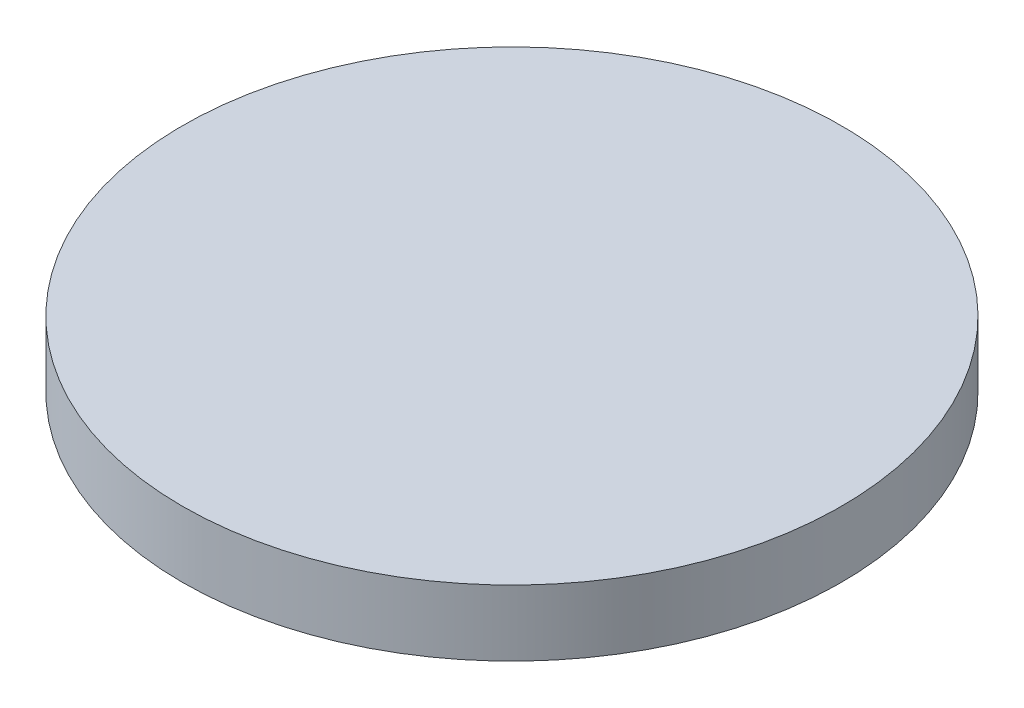
ISO-10303-21;
HEADER;
FILE_DESCRIPTION(('STEP AP214'),'2;1');
FILE_NAME('part.step','',(''),(''),'','','');
FILE_SCHEMA(('AUTOMOTIVE_DESIGN { 1 0 10303 214 1 1 1 1 }'));
ENDSEC;
DATA;
#1=APPLICATION_CONTEXT('core data for automotive mechanical design processes');
#2=APPLICATION_PROTOCOL_DEFINITION('international standard','automotive_design',2000,#1);
#3=PRODUCT_CONTEXT('',#1,'mechanical');
#4=PRODUCT('Part','Part','',(#3));
#5=PRODUCT_RELATED_PRODUCT_CATEGORY('part','',(#4));
#6=PRODUCT_DEFINITION_FORMATION('','',#4);
#7=PRODUCT_DEFINITION_CONTEXT('part definition',#1,'design');
#8=PRODUCT_DEFINITION('design','',#6,#7);
#9=PRODUCT_DEFINITION_SHAPE('','',#8);
#10=(LENGTH_UNIT() NAMED_UNIT(*) SI_UNIT(.MILLI.,.METRE.));
#11=(NAMED_UNIT(*) PLANE_ANGLE_UNIT() SI_UNIT($,.RADIAN.));
#12=(NAMED_UNIT(*) SI_UNIT($,.STERADIAN.) SOLID_ANGLE_UNIT());
#13=UNCERTAINTY_MEASURE_WITH_UNIT(LENGTH_MEASURE(1.E-05),#10,'distance_accuracy_value','');
#14=(GEOMETRIC_REPRESENTATION_CONTEXT(3) GLOBAL_UNCERTAINTY_ASSIGNED_CONTEXT((#13)) GLOBAL_UNIT_ASSIGNED_CONTEXT((#10,
#11,#12)) REPRESENTATION_CONTEXT('',''));
#15=CARTESIAN_POINT('',(0.,0.,0.));
#16=DIRECTION('',(0.,0.,1.));
#17=DIRECTION('',(1.,0.,0.));
#18=AXIS2_PLACEMENT_3D('',#15,#16,#17);
#19=CARTESIAN_POINT('',(0.,0.,0.));
#20=DIRECTION('',(0.,1.,0.));
#21=DIRECTION('',(0.,0.,1.));
#22=AXIS2_PLACEMENT_3D('',#19,#20,#21);
#23=PLANE('',#22);
#24=CARTESIAN_POINT('',(0.,0.,0.));
#25=DIRECTION('',(0.,1.,0.));
#26=DIRECTION('',(0.,0.,1.));
#27=AXIS2_PLACEMENT_3D('',#24,#25,#26);
#28=CIRCLE('',#27,10.);
#29=CARTESIAN_POINT('',(0.,0.,10.));
#30=VERTEX_POINT('',#29);
#31=EDGE_CURVE('E42',#30,#30,#28,.T.);
#32=ORIENTED_EDGE('',*,*,#31,.F.);
#33=EDGE_LOOP('',(#32));
#34=FACE_BOUND('',#33,.T.);
#35=CARTESIAN_POINT('',(0.,0.,0.));
#36=DIRECTION('',(0.,1.,0.));
#37=DIRECTION('',(0.,0.,1.));
#38=AXIS2_PLACEMENT_3D('',#35,#36,#37);
#39=CIRCLE('',#38,4.9);
#40=CARTESIAN_POINT('',(0.,0.,4.9));
#41=VERTEX_POINT('',#40);
#42=EDGE_CURVE('E10',#41,#41,#39,.F.);
#43=ORIENTED_EDGE('',*,*,#42,.F.);
#44=EDGE_LOOP('',(#43));
#45=FACE_BOUND('',#44,.T.);
#46=ADVANCED_FACE('F31',(#34,#45),#23,.F.);
#47=CARTESIAN_POINT('',(0.,2.,0.));
#48=DIRECTION('',(0.,-1.,0.));
#49=DIRECTION('',(0.,0.,-1.));
#50=AXIS2_PLACEMENT_3D('',#47,#48,#49);
#51=CYLINDRICAL_SURFACE('',#50,10.);
#52=CARTESIAN_POINT('',(0.,2.,0.));
#53=DIRECTION('',(0.,1.,0.));
#54=DIRECTION('',(0.,0.,1.));
#55=AXIS2_PLACEMENT_3D('',#52,#53,#54);
#56=CIRCLE('',#55,10.);
#57=CARTESIAN_POINT('',(0.,2.,10.));
#58=VERTEX_POINT('',#57);
#59=EDGE_CURVE('E38',#58,#58,#56,.T.);
#60=ORIENTED_EDGE('',*,*,#59,.F.);
#61=EDGE_LOOP('',(#60));
#62=FACE_BOUND('',#61,.T.);
#63=ORIENTED_EDGE('',*,*,#31,.T.);
#64=EDGE_LOOP('',(#63));
#65=FACE_BOUND('',#64,.T.);
#66=ADVANCED_FACE('F33',(#62,#65),#51,.T.);
#67=CARTESIAN_POINT('',(0.,2.,0.));
#68=DIRECTION('',(0.,1.,0.));
#69=DIRECTION('',(0.,0.,1.));
#70=AXIS2_PLACEMENT_3D('',#67,#68,#69);
#71=PLANE('',#70);
#72=ORIENTED_EDGE('',*,*,#59,.T.);
#73=EDGE_LOOP('',(#72));
#74=FACE_BOUND('',#73,.T.);
#75=ADVANCED_FACE('F56',(#74),#71,.T.);
#76=CARTESIAN_POINT('',(0.,-2.9,0.));
#77=DIRECTION('',(0.,1.,0.));
#78=DIRECTION('',(0.,0.,1.));
#79=AXIS2_PLACEMENT_3D('',#76,#77,#78);
#80=CYLINDRICAL_SURFACE('',#79,4.9);
#81=CARTESIAN_POINT('',(0.,-2.9,0.));
#82=DIRECTION('',(0.,-1.,0.));
#83=DIRECTION('',(0.,0.,-1.));
#84=AXIS2_PLACEMENT_3D('',#81,#82,#83);
#85=CIRCLE('',#84,4.9);
#86=CARTESIAN_POINT('',(0.,-2.9,-4.9));
#87=VERTEX_POINT('',#86);
#88=EDGE_CURVE('E47',#87,#87,#85,.T.);
#89=ORIENTED_EDGE('',*,*,#88,.F.);
#90=EDGE_LOOP('',(#89));
#91=FACE_BOUND('',#90,.T.);
#92=ORIENTED_EDGE('',*,*,#42,.T.);
#93=EDGE_LOOP('',(#92));
#94=FACE_BOUND('',#93,.T.);
#95=ADVANCED_FACE('F54',(#91,#94),#80,.T.);
#96=CARTESIAN_POINT('',(0.,-2.9,0.));
#97=DIRECTION('',(0.,-1.,0.));
#98=DIRECTION('',(0.,0.,-1.));
#99=AXIS2_PLACEMENT_3D('',#96,#97,#98);
#100=PLANE('',#99);
#101=ORIENTED_EDGE('',*,*,#88,.T.);
#102=EDGE_LOOP('',(#101));
#103=FACE_BOUND('',#102,.T.);
#104=ADVANCED_FACE('F52',(#103),#100,.T.);
#105=CLOSED_SHELL('',(#46,#66,#75,#95,#104));
#106=MANIFOLD_SOLID_BREP('B2',#105);
#107=ADVANCED_BREP_SHAPE_REPRESENTATION('',(#18,#106),#14);
#108=SHAPE_DEFINITION_REPRESENTATION(#9,#107);
ENDSEC;
END-ISO-10303-21;
